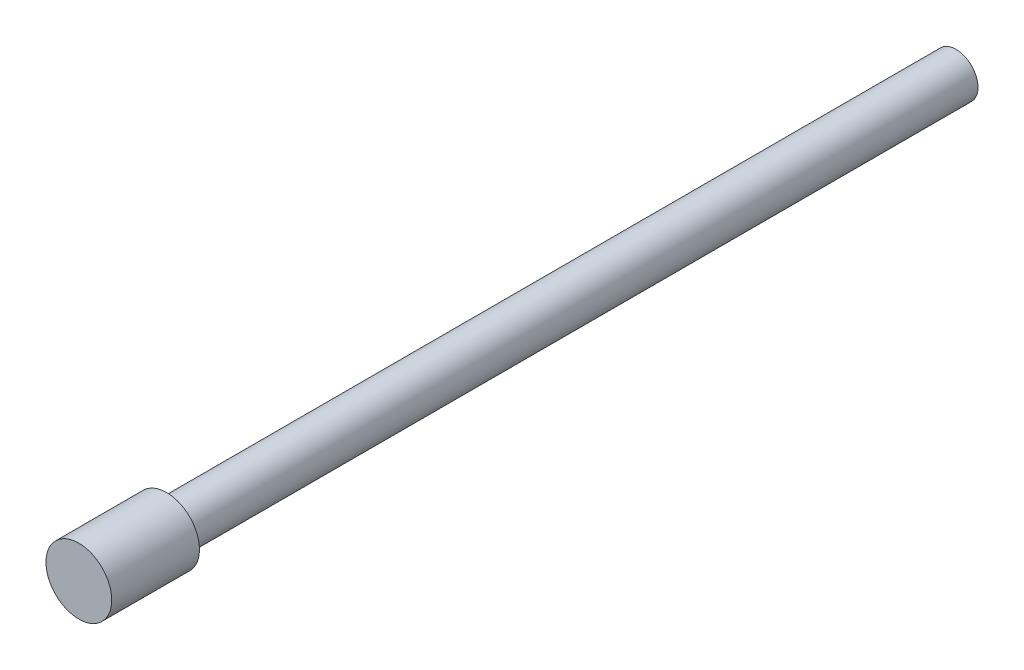
ISO-10303-21;
HEADER;
FILE_DESCRIPTION(('STEP AP214'),'2;1');
FILE_NAME('part.step','',(''),(''),'','','');
FILE_SCHEMA(('AUTOMOTIVE_DESIGN { 1 0 10303 214 1 1 1 1 }'));
ENDSEC;
DATA;
#1=APPLICATION_CONTEXT('core data for automotive mechanical design processes');
#2=APPLICATION_PROTOCOL_DEFINITION('international standard','automotive_design',2000,#1);
#3=PRODUCT_CONTEXT('',#1,'mechanical');
#4=PRODUCT('Part','Part','',(#3));
#5=PRODUCT_RELATED_PRODUCT_CATEGORY('part','',(#4));
#6=PRODUCT_DEFINITION_FORMATION('','',#4);
#7=PRODUCT_DEFINITION_CONTEXT('part definition',#1,'design');
#8=PRODUCT_DEFINITION('design','',#6,#7);
#9=PRODUCT_DEFINITION_SHAPE('','',#8);
#10=(LENGTH_UNIT() NAMED_UNIT(*) SI_UNIT(.MILLI.,.METRE.));
#11=(NAMED_UNIT(*) PLANE_ANGLE_UNIT() SI_UNIT($,.RADIAN.));
#12=(NAMED_UNIT(*) SI_UNIT($,.STERADIAN.) SOLID_ANGLE_UNIT());
#13=UNCERTAINTY_MEASURE_WITH_UNIT(LENGTH_MEASURE(1.E-05),#10,'distance_accuracy_value','');
#14=(GEOMETRIC_REPRESENTATION_CONTEXT(3) GLOBAL_UNCERTAINTY_ASSIGNED_CONTEXT((#13)) GLOBAL_UNIT_ASSIGNED_CONTEXT((#10,
#11,#12)) REPRESENTATION_CONTEXT('',''));
#15=CARTESIAN_POINT('',(0.,0.,0.));
#16=DIRECTION('',(0.,0.,1.));
#17=DIRECTION('',(1.,0.,0.));
#18=AXIS2_PLACEMENT_3D('',#15,#16,#17);
#19=CARTESIAN_POINT('',(0.,0.,-20.));
#20=DIRECTION('',(0.,0.,1.));
#21=DIRECTION('',(1.,0.,0.));
#22=AXIS2_PLACEMENT_3D('',#19,#20,#21);
#23=PLANE('',#22);
#24=CARTESIAN_POINT('',(0.,0.,-20.));
#25=DIRECTION('',(0.,0.,1.));
#26=DIRECTION('',(1.,0.,0.));
#27=AXIS2_PLACEMENT_3D('',#24,#25,#26);
#28=CIRCLE('',#27,7.5);
#29=CARTESIAN_POINT('',(7.5,0.,-20.));
#30=VERTEX_POINT('',#29);
#31=EDGE_CURVE('E38',#30,#30,#28,.T.);
#32=ORIENTED_EDGE('',*,*,#31,.F.);
#33=EDGE_LOOP('',(#32));
#34=FACE_BOUND('',#33,.T.);
#35=CARTESIAN_POINT('',(0.,0.,-20.));
#36=DIRECTION('',(0.,0.,1.));
#37=DIRECTION('',(1.,0.,0.));
#38=AXIS2_PLACEMENT_3D('',#35,#36,#37);
#39=CIRCLE('',#38,5.);
#40=CARTESIAN_POINT('',(5.,0.,-20.));
#41=VERTEX_POINT('',#40);
#42=EDGE_CURVE('E10',#41,#41,#39,.F.);
#43=ORIENTED_EDGE('',*,*,#42,.F.);
#44=EDGE_LOOP('',(#43));
#45=FACE_BOUND('',#44,.T.);
#46=ADVANCED_FACE('F31',(#34,#45),#23,.F.);
#47=CARTESIAN_POINT('',(0.,0.,-20.));
#48=DIRECTION('',(0.,0.,1.));
#49=DIRECTION('',(1.,0.,0.));
#50=AXIS2_PLACEMENT_3D('',#47,#48,#49);
#51=CYLINDRICAL_SURFACE('',#50,7.5);
#52=ORIENTED_EDGE('',*,*,#31,.T.);
#53=EDGE_LOOP('',(#52));
#54=FACE_BOUND('',#53,.T.);
#55=CARTESIAN_POINT('',(0.,0.,0.));
#56=DIRECTION('',(0.,0.,1.));
#57=DIRECTION('',(1.,0.,0.));
#58=AXIS2_PLACEMENT_3D('',#55,#56,#57);
#59=CIRCLE('',#58,7.5);
#60=CARTESIAN_POINT('',(7.5,0.,0.));
#61=VERTEX_POINT('',#60);
#62=EDGE_CURVE('E42',#61,#61,#59,.T.);
#63=ORIENTED_EDGE('',*,*,#62,.F.);
#64=EDGE_LOOP('',(#63));
#65=FACE_BOUND('',#64,.T.);
#66=ADVANCED_FACE('F33',(#54,#65),#51,.T.);
#67=CARTESIAN_POINT('',(0.,0.,0.));
#68=DIRECTION('',(0.,0.,1.));
#69=DIRECTION('',(1.,0.,0.));
#70=AXIS2_PLACEMENT_3D('',#67,#68,#69);
#71=PLANE('',#70);
#72=ORIENTED_EDGE('',*,*,#62,.T.);
#73=EDGE_LOOP('',(#72));
#74=FACE_BOUND('',#73,.T.);
#75=ADVANCED_FACE('F56',(#74),#71,.T.);
#76=CARTESIAN_POINT('',(0.,0.,-200.));
#77=DIRECTION('',(0.,0.,1.));
#78=DIRECTION('',(1.,0.,0.));
#79=AXIS2_PLACEMENT_3D('',#76,#77,#78);
#80=CYLINDRICAL_SURFACE('',#79,5.);
#81=CARTESIAN_POINT('',(0.,0.,-200.));
#82=DIRECTION('',(0.,0.,-1.));
#83=DIRECTION('',(-1.,0.,0.));
#84=AXIS2_PLACEMENT_3D('',#81,#82,#83);
#85=CIRCLE('',#84,5.);
#86=CARTESIAN_POINT('',(5.,0.,-200.));
#87=VERTEX_POINT('',#86);
#88=EDGE_CURVE('E47',#87,#87,#85,.T.);
#89=CARTESIAN_POINT('',(5.,0.,-200.));
#90=CARTESIAN_POINT('',(5.,0.,-198.125));
#91=CARTESIAN_POINT('',(5.,0.,-196.25));
#92=CARTESIAN_POINT('',(5.,0.,-192.5));
#93=CARTESIAN_POINT('',(5.,0.,-190.625));
#94=CARTESIAN_POINT('',(5.,0.,-186.875));
#95=CARTESIAN_POINT('',(5.,0.,-185.));
#96=CARTESIAN_POINT('',(5.,0.,-181.25));
#97=CARTESIAN_POINT('',(5.,0.,-179.375));
#98=CARTESIAN_POINT('',(5.,0.,-175.625));
#99=CARTESIAN_POINT('',(5.,0.,-173.75));
#100=CARTESIAN_POINT('',(5.,0.,-170.));
#101=CARTESIAN_POINT('',(5.,0.,-168.125));
#102=CARTESIAN_POINT('',(5.,0.,-164.375));
#103=CARTESIAN_POINT('',(5.,0.,-162.5));
#104=CARTESIAN_POINT('',(5.,0.,-158.75));
#105=CARTESIAN_POINT('',(5.,0.,-156.875));
#106=CARTESIAN_POINT('',(5.,0.,-153.125));
#107=CARTESIAN_POINT('',(5.,0.,-151.25));
#108=CARTESIAN_POINT('',(5.,0.,-147.5));
#109=CARTESIAN_POINT('',(5.,0.,-145.625));
#110=CARTESIAN_POINT('',(5.,0.,-141.875));
#111=CARTESIAN_POINT('',(5.,0.,-140.));
#112=CARTESIAN_POINT('',(5.,0.,-136.25));
#113=CARTESIAN_POINT('',(5.,0.,-134.375));
#114=CARTESIAN_POINT('',(5.,0.,-130.625));
#115=CARTESIAN_POINT('',(5.,0.,-128.75));
#116=CARTESIAN_POINT('',(5.,0.,-125.));
#117=CARTESIAN_POINT('',(5.,0.,-123.125));
#118=CARTESIAN_POINT('',(5.,0.,-119.375));
#119=CARTESIAN_POINT('',(5.,0.,-117.5));
#120=CARTESIAN_POINT('',(5.,0.,-113.75));
#121=CARTESIAN_POINT('',(5.,0.,-111.875));
#122=CARTESIAN_POINT('',(5.,0.,-108.125));
#123=CARTESIAN_POINT('',(5.,0.,-106.25));
#124=CARTESIAN_POINT('',(5.,0.,-102.5));
#125=CARTESIAN_POINT('',(5.,0.,-100.625));
#126=CARTESIAN_POINT('',(5.,0.,-96.875));
#127=CARTESIAN_POINT('',(5.,0.,-95.));
#128=CARTESIAN_POINT('',(5.,0.,-91.25));
#129=CARTESIAN_POINT('',(5.,0.,-89.375));
#130=CARTESIAN_POINT('',(5.,0.,-85.625));
#131=CARTESIAN_POINT('',(5.,0.,-83.75));
#132=CARTESIAN_POINT('',(5.,0.,-80.));
#133=CARTESIAN_POINT('',(5.,0.,-78.125));
#134=CARTESIAN_POINT('',(5.,0.,-74.375));
#135=CARTESIAN_POINT('',(5.,0.,-72.5));
#136=CARTESIAN_POINT('',(5.,0.,-68.75));
#137=CARTESIAN_POINT('',(5.,0.,-66.875));
#138=CARTESIAN_POINT('',(5.,0.,-63.125));
#139=CARTESIAN_POINT('',(5.,0.,-61.25));
#140=CARTESIAN_POINT('',(5.,0.,-57.5));
#141=CARTESIAN_POINT('',(5.,0.,-55.625));
#142=CARTESIAN_POINT('',(5.,0.,-51.875));
#143=CARTESIAN_POINT('',(5.,0.,-50.));
#144=CARTESIAN_POINT('',(5.,0.,-46.25));
#145=CARTESIAN_POINT('',(5.,0.,-44.375));
#146=CARTESIAN_POINT('',(5.,0.,-40.625));
#147=CARTESIAN_POINT('',(5.,0.,-38.75));
#148=CARTESIAN_POINT('',(5.,0.,-35.));
#149=CARTESIAN_POINT('',(5.,0.,-33.125));
#150=CARTESIAN_POINT('',(5.,0.,-29.375));
#151=CARTESIAN_POINT('',(5.,0.,-27.5));
#152=CARTESIAN_POINT('',(5.,0.,-23.75));
#153=CARTESIAN_POINT('',(5.,0.,-21.875));
#154=CARTESIAN_POINT('',(5.,0.,-20.));
#155=B_SPLINE_CURVE_WITH_KNOTS('',3,(#89,#90,#91,#92,#93,#94,#95,#96,#97,#98,#99,#100,#101,#102,
#103,#104,#105,#106,#107,#108,#109,#110,#111,#112,#113,#114,#115,#116,#117,#118,#119,#120,#121,
#122,#123,#124,#125,#126,#127,#128,#129,#130,#131,#132,#133,#134,#135,#136,#137,#138,#139,#140,
#141,#142,#143,#144,#145,#146,#147,#148,#149,#150,#151,#152,#153,#154),.UNSPECIFIED.,.F.,.F.,(4,
2,2,2,2,2,2,2,2,2,2,2,2,2,2,2,2,2,2,2,2,2,2,2,2,2,2,2,2,2,2,2,4),(0.,5.62500000000002,11.25,
16.875,22.5,28.125,33.75,39.375,45.,50.625,56.25,61.875,67.5,73.125,78.75,84.375,90.,95.625,
101.25,106.875,112.5,118.125,123.75,129.375,135.,140.625,146.25,151.875,157.5,163.125,168.75,
174.375,180.),.UNSPECIFIED.);
#156=EDGE_CURVE('BSEAM54',#87,#41,#155,.T.);
#157=ORIENTED_EDGE('',*,*,#88,.F.);
#158=ORIENTED_EDGE('',*,*,#42,.T.);
#159=ORIENTED_EDGE('',*,*,#156,.T.);
#160=ORIENTED_EDGE('',*,*,#156,.F.);
#161=EDGE_LOOP('',(#157,#159,#158,#160));
#162=FACE_BOUND('',#161,.T.);
#163=ADVANCED_FACE('F54',(#162),#80,.T.);
#164=CARTESIAN_POINT('',(0.,0.,-200.));
#165=DIRECTION('',(0.,0.,-1.));
#166=DIRECTION('',(-1.,0.,0.));
#167=AXIS2_PLACEMENT_3D('',#164,#165,#166);
#168=PLANE('',#167);
#169=ORIENTED_EDGE('',*,*,#88,.T.);
#170=EDGE_LOOP('',(#169));
#171=FACE_BOUND('',#170,.T.);
#172=ADVANCED_FACE('F52',(#171),#168,.T.);
#173=CLOSED_SHELL('',(#46,#66,#75,#163,#172));
#174=MANIFOLD_SOLID_BREP('B2',#173);
#175=ADVANCED_BREP_SHAPE_REPRESENTATION('',(#18,#174),#14);
#176=SHAPE_DEFINITION_REPRESENTATION(#9,#175);
ENDSEC;
END-ISO-10303-21;
